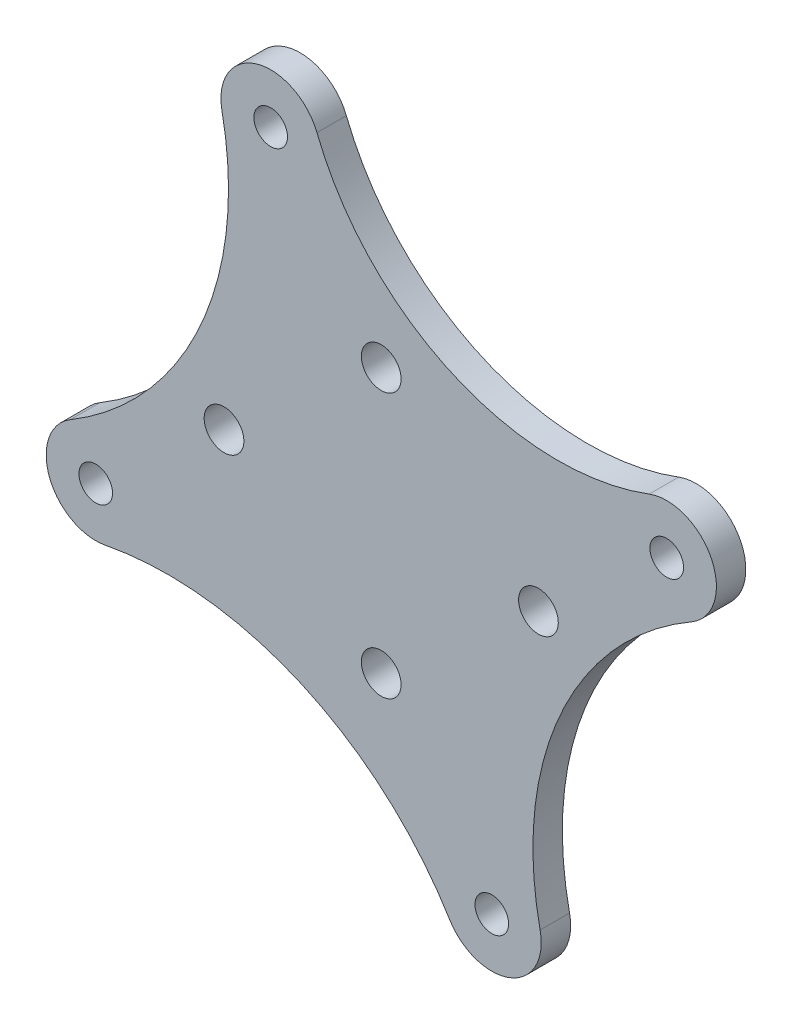
ISO-10303-21;
HEADER;
FILE_DESCRIPTION(('STEP AP214'),'2;1');
FILE_NAME('part.step','',(''),(''),'','','');
FILE_SCHEMA(('AUTOMOTIVE_DESIGN { 1 0 10303 214 1 1 1 1 }'));
ENDSEC;
DATA;
#1=APPLICATION_CONTEXT('core data for automotive mechanical design processes');
#2=APPLICATION_PROTOCOL_DEFINITION('international standard','automotive_design',2000,#1);
#3=PRODUCT_CONTEXT('',#1,'mechanical');
#4=PRODUCT('Part','Part','',(#3));
#5=PRODUCT_RELATED_PRODUCT_CATEGORY('part','',(#4));
#6=PRODUCT_DEFINITION_FORMATION('','',#4);
#7=PRODUCT_DEFINITION_CONTEXT('part definition',#1,'design');
#8=PRODUCT_DEFINITION('design','',#6,#7);
#9=PRODUCT_DEFINITION_SHAPE('','',#8);
#10=(LENGTH_UNIT() NAMED_UNIT(*) SI_UNIT(.MILLI.,.METRE.));
#11=(NAMED_UNIT(*) PLANE_ANGLE_UNIT() SI_UNIT($,.RADIAN.));
#12=(NAMED_UNIT(*) SI_UNIT($,.STERADIAN.) SOLID_ANGLE_UNIT());
#13=UNCERTAINTY_MEASURE_WITH_UNIT(LENGTH_MEASURE(1.E-05),#10,'distance_accuracy_value','');
#14=(GEOMETRIC_REPRESENTATION_CONTEXT(3) GLOBAL_UNCERTAINTY_ASSIGNED_CONTEXT((#13)) GLOBAL_UNIT_ASSIGNED_CONTEXT((#10,
#11,#12)) REPRESENTATION_CONTEXT('',''));
#15=CARTESIAN_POINT('',(0.,0.,0.));
#16=DIRECTION('',(0.,0.,1.));
#17=DIRECTION('',(1.,0.,0.));
#18=AXIS2_PLACEMENT_3D('',#15,#16,#17);
#19=CARTESIAN_POINT('',(-3.0991386590991,-23.2282203722149,1.778));
#20=DIRECTION('',(0.,0.,-1.));
#21=DIRECTION('',(-1.,0.,0.));
#22=AXIS2_PLACEMENT_3D('',#19,#20,#21);
#23=PLANE('',#22);
#24=CARTESIAN_POINT('',(-6.67976450353863,17.2437525616304,1.778));
#25=DIRECTION('',(0.,0.,1.));
#26=DIRECTION('',(1.,0.,0.));
#27=AXIS2_PLACEMENT_3D('',#24,#25,#26);
#28=CIRCLE('',#27,1.016);
#29=CARTESIAN_POINT('',(-5.66376450353864,17.2437525616304,1.778));
#30=VERTEX_POINT('',#29);
#31=EDGE_CURVE('E211',#30,#30,#28,.T.);
#32=ORIENTED_EDGE('',*,*,#31,.F.);
#33=EDGE_LOOP('',(#32));
#34=FACE_BOUND('',#33,.T.);
#35=CARTESIAN_POINT('',(6.68311177846092,-17.263013666762,1.778));
#36=DIRECTION('',(0.,0.,1.));
#37=DIRECTION('',(1.,0.,0.));
#38=AXIS2_PLACEMENT_3D('',#35,#36,#37);
#39=CIRCLE('',#38,1.016);
#40=CARTESIAN_POINT('',(7.69911177846092,-17.263013666762,1.778));
#41=VERTEX_POINT('',#40);
#42=EDGE_CURVE('E199',#41,#41,#39,.T.);
#43=ORIENTED_EDGE('',*,*,#42,.F.);
#44=EDGE_LOOP('',(#43));
#45=FACE_BOUND('',#44,.T.);
#46=CARTESIAN_POINT('',(17.2550567516573,6.67180758843399,1.778));
#47=DIRECTION('',(0.,0.,1.));
#48=DIRECTION('',(1.,0.,0.));
#49=AXIS2_PLACEMENT_3D('',#46,#47,#48);
#50=CIRCLE('',#49,1.016);
#51=CARTESIAN_POINT('',(18.2710567516573,6.67180758843399,1.778));
#52=VERTEX_POINT('',#51);
#53=EDGE_CURVE('E187',#52,#52,#50,.T.);
#54=ORIENTED_EDGE('',*,*,#53,.F.);
#55=EDGE_LOOP('',(#54));
#56=FACE_BOUND('',#55,.T.);
#57=CARTESIAN_POINT('',(0.,7.99999999999999,1.778));
#58=DIRECTION('',(0.,0.,1.));
#59=DIRECTION('',(1.,0.,0.));
#60=AXIS2_PLACEMENT_3D('',#57,#58,#59);
#61=CIRCLE('',#60,1.2);
#62=CARTESIAN_POINT('',(1.2,7.99999999999999,1.778));
#63=VERTEX_POINT('',#62);
#64=EDGE_CURVE('E133',#63,#63,#61,.T.);
#65=ORIENTED_EDGE('',*,*,#64,.F.);
#66=EDGE_LOOP('',(#65));
#67=FACE_BOUND('',#66,.T.);
#68=CARTESIAN_POINT('',(-12.8813890966591,-29.1934270776679,1.778));
#69=DIRECTION('',(0.,0.,-1.));
#70=DIRECTION('',(-1.,0.,0.));
#71=AXIS2_PLACEMENT_3D('',#68,#69,#70);
#72=CIRCLE('',#71,19.9266576105004);
#73=CARTESIAN_POINT('',(-16.6804794750814,-9.6322769115173,1.778));
#74=VERTEX_POINT('',#73);
#75=CARTESIAN_POINT('',(4.13159039269845,-18.8189289008493,1.778));
#76=VERTEX_POINT('',#75);
#77=EDGE_CURVE('E144',#74,#76,#72,.T.);
#78=ORIENTED_EDGE('',*,*,#77,.T.);
#79=CARTESIAN_POINT('',(6.68311177846092,-17.263013666762,1.778));
#80=DIRECTION('',(0.,0.,1.));
#81=DIRECTION('',(1.,0.,0.));
#82=AXIS2_PLACEMENT_3D('',#79,#80,#81);
#83=CIRCLE('',#82,2.98850022547569);
#84=CARTESIAN_POINT('',(9.60373531377862,-16.6296956087401,1.778));
#85=VERTEX_POINT('',#84);
#86=EDGE_CURVE('E92',#76,#85,#83,.T.);
#87=ORIENTED_EDGE('',*,*,#86,.T.);
#88=CARTESIAN_POINT('',(28.3849415425685,-12.5571142190843,1.778));
#89=DIRECTION('',(0.,0.,-1.));
#90=DIRECTION('',(1.,0.,0.));
#91=AXIS2_PLACEMENT_3D('',#88,#89,#90);
#92=CIRCLE('',#91,19.21769045915);
#93=CARTESIAN_POINT('',(18.7578976717847,4.07537365536525,1.778));
#94=VERTEX_POINT('',#93);
#95=EDGE_CURVE('E159',#85,#94,#92,.T.);
#96=ORIENTED_EDGE('',*,*,#95,.T.);
#97=CARTESIAN_POINT('',(17.2550567516573,6.67180758843399,1.778));
#98=DIRECTION('',(0.,0.,1.));
#99=DIRECTION('',(1.,0.,0.));
#100=AXIS2_PLACEMENT_3D('',#97,#98,#99);
#101=CIRCLE('',#100,3.);
#102=CARTESIAN_POINT('',(16.1974763313224,9.47921273456523,1.778));
#103=VERTEX_POINT('',#102);
#104=EDGE_CURVE('E172',#94,#103,#101,.T.);
#105=ORIENTED_EDGE('',*,*,#104,.T.);
#106=CARTESIAN_POINT('',(10.6745440126845,24.1401390480161,1.778));
#107=DIRECTION('',(0.,0.,-1.));
#108=DIRECTION('',(1.,0.,0.));
#109=AXIS2_PLACEMENT_3D('',#106,#107,#108);
#110=CIRCLE('',#109,15.6667016874864);
#111=CARTESIAN_POINT('',(-3.88470189429374,18.3544756992869,1.778));
#112=VERTEX_POINT('',#111);
#113=EDGE_CURVE('E111',#103,#112,#110,.T.);
#114=ORIENTED_EDGE('',*,*,#113,.T.);
#115=CARTESIAN_POINT('',(-6.67976450353863,17.2437525616304,1.778));
#116=DIRECTION('',(0.,0.,1.));
#117=DIRECTION('',(1.,0.,0.));
#118=AXIS2_PLACEMENT_3D('',#115,#116,#117);
#119=CIRCLE('',#118,3.00767034066641);
#120=CARTESIAN_POINT('',(-9.62635443118783,16.640686498582,1.778));
#121=VERTEX_POINT('',#120);
#122=EDGE_CURVE('E105',#112,#121,#119,.T.);
#123=ORIENTED_EDGE('',*,*,#122,.T.);
#124=CARTESIAN_POINT('',(-28.8237786490458,12.7116311064154,1.778));
#125=DIRECTION('',(0.,0.,-1.));
#126=DIRECTION('',(1.,0.,0.));
#127=AXIS2_PLACEMENT_3D('',#124,#125,#126);
#128=CIRCLE('',#127,19.5953712104444);
#129=CARTESIAN_POINT('',(-18.7864363023151,-4.11781723539426,1.778));
#130=VERTEX_POINT('',#129);
#131=EDGE_CURVE('E109',#121,#130,#128,.T.);
#132=ORIENTED_EDGE('',*,*,#131,.T.);
#133=CARTESIAN_POINT('',(-17.251709476735,-6.69106869356558,1.778));
#134=DIRECTION('',(0.,0.,1.));
#135=DIRECTION('',(1.,0.,0.));
#136=AXIS2_PLACEMENT_3D('',#133,#134,#135);
#137=CIRCLE('',#136,2.99616579917333);
#138=EDGE_CURVE('E49',#130,#74,#137,.T.);
#139=ORIENTED_EDGE('',*,*,#138,.T.);
#140=EDGE_LOOP('',(#78,#87,#96,#105,#114,#123,#132,#139));
#141=FACE_BOUND('',#140,.T.);
#142=CARTESIAN_POINT('',(-9.5,0.,1.778));
#143=DIRECTION('',(0.,0.,1.));
#144=DIRECTION('',(1.,0.,0.));
#145=AXIS2_PLACEMENT_3D('',#142,#143,#144);
#146=CIRCLE('',#145,1.2);
#147=CARTESIAN_POINT('',(-8.3,0.,1.778));
#148=VERTEX_POINT('',#147);
#149=EDGE_CURVE('E181',#148,#148,#146,.T.);
#150=ORIENTED_EDGE('',*,*,#149,.F.);
#151=EDGE_LOOP('',(#150));
#152=FACE_BOUND('',#151,.T.);
#153=CARTESIAN_POINT('',(0.,-7.99999999999999,1.778));
#154=DIRECTION('',(0.,0.,1.));
#155=DIRECTION('',(1.,0.,0.));
#156=AXIS2_PLACEMENT_3D('',#153,#154,#155);
#157=CIRCLE('',#156,1.2);
#158=CARTESIAN_POINT('',(1.19999999999994,-7.99999999999999,1.778));
#159=VERTEX_POINT('',#158);
#160=EDGE_CURVE('E193',#159,#159,#157,.T.);
#161=ORIENTED_EDGE('',*,*,#160,.F.);
#162=EDGE_LOOP('',(#161));
#163=FACE_BOUND('',#162,.T.);
#164=CARTESIAN_POINT('',(-17.251709476735,-6.69106869356558,1.778));
#165=DIRECTION('',(0.,0.,1.));
#166=DIRECTION('',(1.,0.,0.));
#167=AXIS2_PLACEMENT_3D('',#164,#165,#166);
#168=CIRCLE('',#167,1.016);
#169=CARTESIAN_POINT('',(-16.235709476735,-6.69106869356558,1.778));
#170=VERTEX_POINT('',#169);
#171=EDGE_CURVE('E205',#170,#170,#168,.T.);
#172=ORIENTED_EDGE('',*,*,#171,.F.);
#173=EDGE_LOOP('',(#172));
#174=FACE_BOUND('',#173,.T.);
#175=CARTESIAN_POINT('',(9.5,0.,1.778));
#176=DIRECTION('',(0.,0.,1.));
#177=DIRECTION('',(1.,0.,0.));
#178=AXIS2_PLACEMENT_3D('',#175,#176,#177);
#179=CIRCLE('',#178,1.2);
#180=CARTESIAN_POINT('',(10.7,0.,1.778));
#181=VERTEX_POINT('',#180);
#182=EDGE_CURVE('E217',#181,#181,#179,.T.);
#183=ORIENTED_EDGE('',*,*,#182,.F.);
#184=EDGE_LOOP('',(#183));
#185=FACE_BOUND('',#184,.T.);
#186=ADVANCED_FACE('F32',(#34,#45,#56,#67,#141,#152,#163,#174,#185),#23,.F.);
#187=CARTESIAN_POINT('',(-3.0991386590991,-23.2282203722149,0.));
#188=DIRECTION('',(0.,0.,-1.));
#189=DIRECTION('',(-1.,0.,0.));
#190=AXIS2_PLACEMENT_3D('',#187,#188,#189);
#191=PLANE('',#190);
#192=CARTESIAN_POINT('',(-6.67976450353863,17.2437525616304,0.));
#193=DIRECTION('',(0.,0.,1.));
#194=DIRECTION('',(1.,0.,0.));
#195=AXIS2_PLACEMENT_3D('',#192,#193,#194);
#196=CIRCLE('',#195,1.016);
#197=CARTESIAN_POINT('',(-5.66376450353864,17.2437525616304,0.));
#198=VERTEX_POINT('',#197);
#199=EDGE_CURVE('E214',#198,#198,#196,.T.);
#200=ORIENTED_EDGE('',*,*,#199,.T.);
#201=EDGE_LOOP('',(#200));
#202=FACE_BOUND('',#201,.T.);
#203=CARTESIAN_POINT('',(6.68311177846092,-17.263013666762,0.));
#204=DIRECTION('',(0.,0.,1.));
#205=DIRECTION('',(1.,0.,0.));
#206=AXIS2_PLACEMENT_3D('',#203,#204,#205);
#207=CIRCLE('',#206,1.016);
#208=CARTESIAN_POINT('',(7.69911177846092,-17.263013666762,0.));
#209=VERTEX_POINT('',#208);
#210=EDGE_CURVE('E202',#209,#209,#207,.T.);
#211=ORIENTED_EDGE('',*,*,#210,.T.);
#212=EDGE_LOOP('',(#211));
#213=FACE_BOUND('',#212,.T.);
#214=CARTESIAN_POINT('',(17.2550567516573,6.67180758843399,0.));
#215=DIRECTION('',(0.,0.,1.));
#216=DIRECTION('',(1.,0.,0.));
#217=AXIS2_PLACEMENT_3D('',#214,#215,#216);
#218=CIRCLE('',#217,1.016);
#219=CARTESIAN_POINT('',(18.2710567516573,6.67180758843399,0.));
#220=VERTEX_POINT('',#219);
#221=EDGE_CURVE('E190',#220,#220,#218,.T.);
#222=ORIENTED_EDGE('',*,*,#221,.T.);
#223=EDGE_LOOP('',(#222));
#224=FACE_BOUND('',#223,.T.);
#225=CARTESIAN_POINT('',(0.,7.99999999999999,0.));
#226=DIRECTION('',(0.,0.,1.));
#227=DIRECTION('',(1.,0.,0.));
#228=AXIS2_PLACEMENT_3D('',#225,#226,#227);
#229=CIRCLE('',#228,1.2);
#230=CARTESIAN_POINT('',(1.2,7.99999999999999,0.));
#231=VERTEX_POINT('',#230);
#232=EDGE_CURVE('E178',#231,#231,#229,.T.);
#233=ORIENTED_EDGE('',*,*,#232,.T.);
#234=EDGE_LOOP('',(#233));
#235=FACE_BOUND('',#234,.T.);
#236=CARTESIAN_POINT('',(-12.8813890966591,-29.1934270776679,0.));
#237=DIRECTION('',(0.,0.,-1.));
#238=DIRECTION('',(-1.,0.,0.));
#239=AXIS2_PLACEMENT_3D('',#236,#237,#238);
#240=CIRCLE('',#239,19.9266576105004);
#241=CARTESIAN_POINT('',(-16.6804794750814,-9.6322769115173,0.));
#242=VERTEX_POINT('',#241);
#243=CARTESIAN_POINT('',(4.13159039269845,-18.8189289008493,0.));
#244=VERTEX_POINT('',#243);
#245=EDGE_CURVE('E129',#242,#244,#240,.T.);
#246=ORIENTED_EDGE('',*,*,#245,.F.);
#247=CARTESIAN_POINT('',(-17.251709476735,-6.69106869356558,0.));
#248=DIRECTION('',(0.,0.,1.));
#249=DIRECTION('',(1.,0.,0.));
#250=AXIS2_PLACEMENT_3D('',#247,#248,#249);
#251=CIRCLE('',#250,2.99616579917333);
#252=CARTESIAN_POINT('',(-18.7864363023151,-4.11781723539426,0.));
#253=VERTEX_POINT('',#252);
#254=EDGE_CURVE('E84',#253,#242,#251,.T.);
#255=ORIENTED_EDGE('',*,*,#254,.F.);
#256=CARTESIAN_POINT('',(-28.8237786490458,12.7116311064154,0.));
#257=DIRECTION('',(0.,0.,-1.));
#258=DIRECTION('',(1.,0.,0.));
#259=AXIS2_PLACEMENT_3D('',#256,#257,#258);
#260=CIRCLE('',#259,19.5953712104444);
#261=CARTESIAN_POINT('',(-9.62635443118783,16.640686498582,0.));
#262=VERTEX_POINT('',#261);
#263=EDGE_CURVE('E78',#262,#253,#260,.T.);
#264=ORIENTED_EDGE('',*,*,#263,.F.);
#265=CARTESIAN_POINT('',(-6.67976450353863,17.2437525616304,0.));
#266=DIRECTION('',(0.,0.,1.));
#267=DIRECTION('',(1.,0.,0.));
#268=AXIS2_PLACEMENT_3D('',#265,#266,#267);
#269=CIRCLE('',#268,3.00767034066641);
#270=CARTESIAN_POINT('',(-3.88470189429374,18.3544756992869,0.));
#271=VERTEX_POINT('',#270);
#272=EDGE_CURVE('E119',#271,#262,#269,.T.);
#273=ORIENTED_EDGE('',*,*,#272,.F.);
#274=CARTESIAN_POINT('',(10.6745440126845,24.1401390480161,0.));
#275=DIRECTION('',(0.,0.,-1.));
#276=DIRECTION('',(1.,0.,0.));
#277=AXIS2_PLACEMENT_3D('',#274,#275,#276);
#278=CIRCLE('',#277,15.6667016874864);
#279=CARTESIAN_POINT('',(16.1974763313224,9.47921273456523,0.));
#280=VERTEX_POINT('',#279);
#281=EDGE_CURVE('E139',#280,#271,#278,.T.);
#282=ORIENTED_EDGE('',*,*,#281,.F.);
#283=CARTESIAN_POINT('',(17.2550567516573,6.67180758843399,0.));
#284=DIRECTION('',(0.,0.,1.));
#285=DIRECTION('',(1.,0.,0.));
#286=AXIS2_PLACEMENT_3D('',#283,#284,#285);
#287=CIRCLE('',#286,3.);
#288=CARTESIAN_POINT('',(18.7578976717847,4.07537365536525,0.));
#289=VERTEX_POINT('',#288);
#290=EDGE_CURVE('E137',#289,#280,#287,.T.);
#291=ORIENTED_EDGE('',*,*,#290,.F.);
#292=CARTESIAN_POINT('',(28.3849415425685,-12.5571142190843,0.));
#293=DIRECTION('',(0.,0.,-1.));
#294=DIRECTION('',(1.,0.,0.));
#295=AXIS2_PLACEMENT_3D('',#292,#293,#294);
#296=CIRCLE('',#295,19.21769045915);
#297=CARTESIAN_POINT('',(9.60373531377862,-16.6296956087401,0.));
#298=VERTEX_POINT('',#297);
#299=EDGE_CURVE('E135',#298,#289,#296,.T.);
#300=ORIENTED_EDGE('',*,*,#299,.F.);
#301=CARTESIAN_POINT('',(6.68311177846092,-17.263013666762,0.));
#302=DIRECTION('',(0.,0.,1.));
#303=DIRECTION('',(1.,0.,0.));
#304=AXIS2_PLACEMENT_3D('',#301,#302,#303);
#305=CIRCLE('',#304,2.98850022547569);
#306=EDGE_CURVE('E132',#244,#298,#305,.T.);
#307=ORIENTED_EDGE('',*,*,#306,.F.);
#308=EDGE_LOOP('',(#246,#255,#264,#273,#282,#291,#300,#307));
#309=FACE_BOUND('',#308,.T.);
#310=CARTESIAN_POINT('',(-9.5,0.,0.));
#311=DIRECTION('',(0.,0.,1.));
#312=DIRECTION('',(1.,0.,0.));
#313=AXIS2_PLACEMENT_3D('',#310,#311,#312);
#314=CIRCLE('',#313,1.2);
#315=CARTESIAN_POINT('',(-8.3,0.,0.));
#316=VERTEX_POINT('',#315);
#317=EDGE_CURVE('E184',#316,#316,#314,.T.);
#318=ORIENTED_EDGE('',*,*,#317,.T.);
#319=EDGE_LOOP('',(#318));
#320=FACE_BOUND('',#319,.T.);
#321=CARTESIAN_POINT('',(0.,-7.99999999999999,0.));
#322=DIRECTION('',(0.,0.,1.));
#323=DIRECTION('',(1.,0.,0.));
#324=AXIS2_PLACEMENT_3D('',#321,#322,#323);
#325=CIRCLE('',#324,1.2);
#326=CARTESIAN_POINT('',(1.19999999999994,-7.99999999999999,0.));
#327=VERTEX_POINT('',#326);
#328=EDGE_CURVE('E196',#327,#327,#325,.T.);
#329=ORIENTED_EDGE('',*,*,#328,.T.);
#330=EDGE_LOOP('',(#329));
#331=FACE_BOUND('',#330,.T.);
#332=CARTESIAN_POINT('',(-17.251709476735,-6.69106869356558,0.));
#333=DIRECTION('',(0.,0.,1.));
#334=DIRECTION('',(1.,0.,0.));
#335=AXIS2_PLACEMENT_3D('',#332,#333,#334);
#336=CIRCLE('',#335,1.016);
#337=CARTESIAN_POINT('',(-16.235709476735,-6.69106869356558,0.));
#338=VERTEX_POINT('',#337);
#339=EDGE_CURVE('E208',#338,#338,#336,.T.);
#340=ORIENTED_EDGE('',*,*,#339,.T.);
#341=EDGE_LOOP('',(#340));
#342=FACE_BOUND('',#341,.T.);
#343=CARTESIAN_POINT('',(9.5,0.,0.));
#344=DIRECTION('',(0.,0.,1.));
#345=DIRECTION('',(1.,0.,0.));
#346=AXIS2_PLACEMENT_3D('',#343,#344,#345);
#347=CIRCLE('',#346,1.2);
#348=CARTESIAN_POINT('',(10.7,0.,0.));
#349=VERTEX_POINT('',#348);
#350=EDGE_CURVE('E220',#349,#349,#347,.T.);
#351=ORIENTED_EDGE('',*,*,#350,.T.);
#352=EDGE_LOOP('',(#351));
#353=FACE_BOUND('',#352,.T.);
#354=ADVANCED_FACE('F163',(#202,#213,#224,#235,#309,#320,#331,#342,#353),#191,.T.);
#355=CARTESIAN_POINT('',(-12.8813890966591,-29.1934270776679,1.778));
#356=DIRECTION('',(0.,0.,-1.));
#357=DIRECTION('',(-1.,0.,0.));
#358=AXIS2_PLACEMENT_3D('',#355,#356,#357);
#359=CYLINDRICAL_SURFACE('',#358,19.9266576105004);
#360=ORIENTED_EDGE('',*,*,#245,.T.);
#361=DIRECTION('',(0.,0.,-1.));
#362=VECTOR('',#361,1.);
#363=CARTESIAN_POINT('',(4.13159039269845,-18.8189289008493,1.778));
#364=LINE('',#363,#362);
#365=EDGE_CURVE('E11',#76,#244,#364,.T.);
#366=ORIENTED_EDGE('',*,*,#365,.F.);
#367=ORIENTED_EDGE('',*,*,#77,.F.);
#368=DIRECTION('',(0.,0.,-1.));
#369=VECTOR('',#368,1.);
#370=CARTESIAN_POINT('',(-16.6804794750814,-9.6322769115173,1.778));
#371=LINE('',#370,#369);
#372=EDGE_CURVE('E125',#74,#242,#371,.T.);
#373=ORIENTED_EDGE('',*,*,#372,.T.);
#374=EDGE_LOOP('',(#360,#366,#367,#373));
#375=FACE_BOUND('',#374,.T.);
#376=ADVANCED_FACE('F34',(#375),#359,.F.);
#377=CARTESIAN_POINT('',(6.68311177846092,-17.263013666762,1.778));
#378=DIRECTION('',(0.,0.,-1.));
#379=DIRECTION('',(-1.,0.,0.));
#380=AXIS2_PLACEMENT_3D('',#377,#378,#379);
#381=CYLINDRICAL_SURFACE('',#380,2.98850022547569);
#382=ORIENTED_EDGE('',*,*,#306,.T.);
#383=DIRECTION('',(0.,0.,-1.));
#384=VECTOR('',#383,1.);
#385=CARTESIAN_POINT('',(9.60373531377862,-16.6296956087401,1.778));
#386=LINE('',#385,#384);
#387=EDGE_CURVE('E41',#85,#298,#386,.T.);
#388=ORIENTED_EDGE('',*,*,#387,.F.);
#389=ORIENTED_EDGE('',*,*,#86,.F.);
#390=ORIENTED_EDGE('',*,*,#365,.T.);
#391=EDGE_LOOP('',(#382,#388,#389,#390));
#392=FACE_BOUND('',#391,.T.);
#393=ADVANCED_FACE('F255',(#392),#381,.T.);
#394=CARTESIAN_POINT('',(28.3849415425685,-12.5571142190843,1.778));
#395=DIRECTION('',(0.,0.,-1.));
#396=DIRECTION('',(-1.,0.,0.));
#397=AXIS2_PLACEMENT_3D('',#394,#395,#396);
#398=CYLINDRICAL_SURFACE('',#397,19.21769045915);
#399=ORIENTED_EDGE('',*,*,#299,.T.);
#400=DIRECTION('',(0.,0.,-1.));
#401=VECTOR('',#400,1.);
#402=CARTESIAN_POINT('',(18.7578976717847,4.07537365536525,1.778));
#403=LINE('',#402,#401);
#404=EDGE_CURVE('E151',#94,#289,#403,.T.);
#405=ORIENTED_EDGE('',*,*,#404,.F.);
#406=ORIENTED_EDGE('',*,*,#95,.F.);
#407=ORIENTED_EDGE('',*,*,#387,.T.);
#408=EDGE_LOOP('',(#399,#405,#406,#407));
#409=FACE_BOUND('',#408,.T.);
#410=ADVANCED_FACE('F157',(#409),#398,.F.);
#411=CARTESIAN_POINT('',(17.2550567516573,6.67180758843399,1.778));
#412=DIRECTION('',(0.,0.,-1.));
#413=DIRECTION('',(-1.,0.,0.));
#414=AXIS2_PLACEMENT_3D('',#411,#412,#413);
#415=CYLINDRICAL_SURFACE('',#414,3.);
#416=ORIENTED_EDGE('',*,*,#290,.T.);
#417=DIRECTION('',(0.,0.,-1.));
#418=VECTOR('',#417,1.);
#419=CARTESIAN_POINT('',(16.1974763313224,9.47921273456523,1.778));
#420=LINE('',#419,#418);
#421=EDGE_CURVE('E148',#103,#280,#420,.T.);
#422=ORIENTED_EDGE('',*,*,#421,.F.);
#423=ORIENTED_EDGE('',*,*,#104,.F.);
#424=ORIENTED_EDGE('',*,*,#404,.T.);
#425=EDGE_LOOP('',(#416,#422,#423,#424));
#426=FACE_BOUND('',#425,.T.);
#427=ADVANCED_FACE('F168',(#426),#415,.T.);
#428=CARTESIAN_POINT('',(10.6745440126845,24.1401390480161,1.778));
#429=DIRECTION('',(0.,0.,-1.));
#430=DIRECTION('',(-1.,0.,0.));
#431=AXIS2_PLACEMENT_3D('',#428,#429,#430);
#432=CYLINDRICAL_SURFACE('',#431,15.6667016874864);
#433=ORIENTED_EDGE('',*,*,#281,.T.);
#434=DIRECTION('',(0.,0.,-1.));
#435=VECTOR('',#434,1.);
#436=CARTESIAN_POINT('',(-3.88470189429374,18.3544756992869,1.778));
#437=LINE('',#436,#435);
#438=EDGE_CURVE('E120',#112,#271,#437,.T.);
#439=ORIENTED_EDGE('',*,*,#438,.F.);
#440=ORIENTED_EDGE('',*,*,#113,.F.);
#441=ORIENTED_EDGE('',*,*,#421,.T.);
#442=EDGE_LOOP('',(#433,#439,#440,#441));
#443=FACE_BOUND('',#442,.T.);
#444=ADVANCED_FACE('F171',(#443),#432,.F.);
#445=CARTESIAN_POINT('',(-6.67976450353863,17.2437525616304,1.778));
#446=DIRECTION('',(0.,0.,-1.));
#447=DIRECTION('',(-1.,0.,0.));
#448=AXIS2_PLACEMENT_3D('',#445,#446,#447);
#449=CYLINDRICAL_SURFACE('',#448,3.00767034066641);
#450=ORIENTED_EDGE('',*,*,#272,.T.);
#451=DIRECTION('',(0.,0.,-1.));
#452=VECTOR('',#451,1.);
#453=CARTESIAN_POINT('',(-9.62635443118783,16.640686498582,1.778));
#454=LINE('',#453,#452);
#455=EDGE_CURVE('E116',#121,#262,#454,.T.);
#456=ORIENTED_EDGE('',*,*,#455,.F.);
#457=ORIENTED_EDGE('',*,*,#122,.F.);
#458=ORIENTED_EDGE('',*,*,#438,.T.);
#459=EDGE_LOOP('',(#450,#456,#457,#458));
#460=FACE_BOUND('',#459,.T.);
#461=ADVANCED_FACE('F117',(#460),#449,.T.);
#462=CARTESIAN_POINT('',(-28.8237786490458,12.7116311064154,1.778));
#463=DIRECTION('',(0.,0.,-1.));
#464=DIRECTION('',(-1.,0.,0.));
#465=AXIS2_PLACEMENT_3D('',#462,#463,#464);
#466=CYLINDRICAL_SURFACE('',#465,19.5953712104444);
#467=ORIENTED_EDGE('',*,*,#263,.T.);
#468=DIRECTION('',(0.,0.,-1.));
#469=VECTOR('',#468,1.);
#470=CARTESIAN_POINT('',(-18.7864363023151,-4.11781723539426,1.778));
#471=LINE('',#470,#469);
#472=EDGE_CURVE('E121',#130,#253,#471,.T.);
#473=ORIENTED_EDGE('',*,*,#472,.F.);
#474=ORIENTED_EDGE('',*,*,#131,.F.);
#475=ORIENTED_EDGE('',*,*,#455,.T.);
#476=EDGE_LOOP('',(#467,#473,#474,#475));
#477=FACE_BOUND('',#476,.T.);
#478=ADVANCED_FACE('F123',(#477),#466,.F.);
#479=CARTESIAN_POINT('',(-17.251709476735,-6.69106869356558,1.778));
#480=DIRECTION('',(0.,0.,-1.));
#481=DIRECTION('',(-1.,0.,0.));
#482=AXIS2_PLACEMENT_3D('',#479,#480,#481);
#483=CYLINDRICAL_SURFACE('',#482,2.99616579917333);
#484=ORIENTED_EDGE('',*,*,#254,.T.);
#485=ORIENTED_EDGE('',*,*,#372,.F.);
#486=ORIENTED_EDGE('',*,*,#138,.F.);
#487=ORIENTED_EDGE('',*,*,#472,.T.);
#488=EDGE_LOOP('',(#484,#485,#486,#487));
#489=FACE_BOUND('',#488,.T.);
#490=ADVANCED_FACE('F243',(#489),#483,.T.);
#491=CARTESIAN_POINT('',(0.,7.99999999999999,1.778));
#492=DIRECTION('',(0.,0.,-1.));
#493=DIRECTION('',(-1.,0.,0.));
#494=AXIS2_PLACEMENT_3D('',#491,#492,#493);
#495=CYLINDRICAL_SURFACE('',#494,1.2);
#496=ORIENTED_EDGE('',*,*,#64,.T.);
#497=EDGE_LOOP('',(#496));
#498=FACE_BOUND('',#497,.T.);
#499=ORIENTED_EDGE('',*,*,#232,.F.);
#500=EDGE_LOOP('',(#499));
#501=FACE_BOUND('',#500,.T.);
#502=ADVANCED_FACE('F240',(#498,#501),#495,.F.);
#503=CARTESIAN_POINT('',(-9.5,0.,1.778));
#504=DIRECTION('',(0.,0.,-1.));
#505=DIRECTION('',(-1.,0.,0.));
#506=AXIS2_PLACEMENT_3D('',#503,#504,#505);
#507=CYLINDRICAL_SURFACE('',#506,1.2);
#508=ORIENTED_EDGE('',*,*,#149,.T.);
#509=EDGE_LOOP('',(#508));
#510=FACE_BOUND('',#509,.T.);
#511=ORIENTED_EDGE('',*,*,#317,.F.);
#512=EDGE_LOOP('',(#511));
#513=FACE_BOUND('',#512,.T.);
#514=ADVANCED_FACE('F319',(#510,#513),#507,.F.);
#515=CARTESIAN_POINT('',(17.2550567516573,6.67180758843399,1.778));
#516=DIRECTION('',(0.,0.,-1.));
#517=DIRECTION('',(-1.,0.,0.));
#518=AXIS2_PLACEMENT_3D('',#515,#516,#517);
#519=CYLINDRICAL_SURFACE('',#518,1.016);
#520=ORIENTED_EDGE('',*,*,#53,.T.);
#521=EDGE_LOOP('',(#520));
#522=FACE_BOUND('',#521,.T.);
#523=ORIENTED_EDGE('',*,*,#221,.F.);
#524=EDGE_LOOP('',(#523));
#525=FACE_BOUND('',#524,.T.);
#526=ADVANCED_FACE('F327',(#522,#525),#519,.F.);
#527=CARTESIAN_POINT('',(0.,-7.99999999999999,1.778));
#528=DIRECTION('',(0.,0.,-1.));
#529=DIRECTION('',(-1.,0.,0.));
#530=AXIS2_PLACEMENT_3D('',#527,#528,#529);
#531=CYLINDRICAL_SURFACE('',#530,1.2);
#532=ORIENTED_EDGE('',*,*,#160,.T.);
#533=EDGE_LOOP('',(#532));
#534=FACE_BOUND('',#533,.T.);
#535=ORIENTED_EDGE('',*,*,#328,.F.);
#536=EDGE_LOOP('',(#535));
#537=FACE_BOUND('',#536,.T.);
#538=ADVANCED_FACE('F335',(#534,#537),#531,.F.);
#539=CARTESIAN_POINT('',(6.68311177846092,-17.263013666762,1.778));
#540=DIRECTION('',(0.,0.,-1.));
#541=DIRECTION('',(-1.,0.,0.));
#542=AXIS2_PLACEMENT_3D('',#539,#540,#541);
#543=CYLINDRICAL_SURFACE('',#542,1.016);
#544=ORIENTED_EDGE('',*,*,#42,.T.);
#545=EDGE_LOOP('',(#544));
#546=FACE_BOUND('',#545,.T.);
#547=ORIENTED_EDGE('',*,*,#210,.F.);
#548=EDGE_LOOP('',(#547));
#549=FACE_BOUND('',#548,.T.);
#550=ADVANCED_FACE('F344',(#546,#549),#543,.F.);
#551=CARTESIAN_POINT('',(-17.251709476735,-6.69106869356558,1.778));
#552=DIRECTION('',(0.,0.,-1.));
#553=DIRECTION('',(-1.,0.,0.));
#554=AXIS2_PLACEMENT_3D('',#551,#552,#553);
#555=CYLINDRICAL_SURFACE('',#554,1.016);
#556=ORIENTED_EDGE('',*,*,#171,.T.);
#557=EDGE_LOOP('',(#556));
#558=FACE_BOUND('',#557,.T.);
#559=ORIENTED_EDGE('',*,*,#339,.F.);
#560=EDGE_LOOP('',(#559));
#561=FACE_BOUND('',#560,.T.);
#562=ADVANCED_FACE('F353',(#558,#561),#555,.F.);
#563=CARTESIAN_POINT('',(-6.67976450353863,17.2437525616304,1.778));
#564=DIRECTION('',(0.,0.,-1.));
#565=DIRECTION('',(-1.,0.,0.));
#566=AXIS2_PLACEMENT_3D('',#563,#564,#565);
#567=CYLINDRICAL_SURFACE('',#566,1.016);
#568=ORIENTED_EDGE('',*,*,#31,.T.);
#569=EDGE_LOOP('',(#568));
#570=FACE_BOUND('',#569,.T.);
#571=ORIENTED_EDGE('',*,*,#199,.F.);
#572=EDGE_LOOP('',(#571));
#573=FACE_BOUND('',#572,.T.);
#574=ADVANCED_FACE('F362',(#570,#573),#567,.F.);
#575=CARTESIAN_POINT('',(9.5,0.,1.778));
#576=DIRECTION('',(0.,0.,-1.));
#577=DIRECTION('',(-1.,0.,0.));
#578=AXIS2_PLACEMENT_3D('',#575,#576,#577);
#579=CYLINDRICAL_SURFACE('',#578,1.2);
#580=ORIENTED_EDGE('',*,*,#182,.T.);
#581=EDGE_LOOP('',(#580));
#582=FACE_BOUND('',#581,.T.);
#583=ORIENTED_EDGE('',*,*,#350,.F.);
#584=EDGE_LOOP('',(#583));
#585=FACE_BOUND('',#584,.T.);
#586=ADVANCED_FACE('F226',(#582,#585),#579,.F.);
#587=CLOSED_SHELL('',(#186,#354,#376,#393,#410,#427,#444,#461,#478,#490,#502,#514,#526,#538,
#550,#562,#574,#586));
#588=MANIFOLD_SOLID_BREP('B2',#587);
#589=ADVANCED_BREP_SHAPE_REPRESENTATION('',(#18,#588),#14);
#590=SHAPE_DEFINITION_REPRESENTATION(#9,#589);
ENDSEC;
END-ISO-10303-21;
